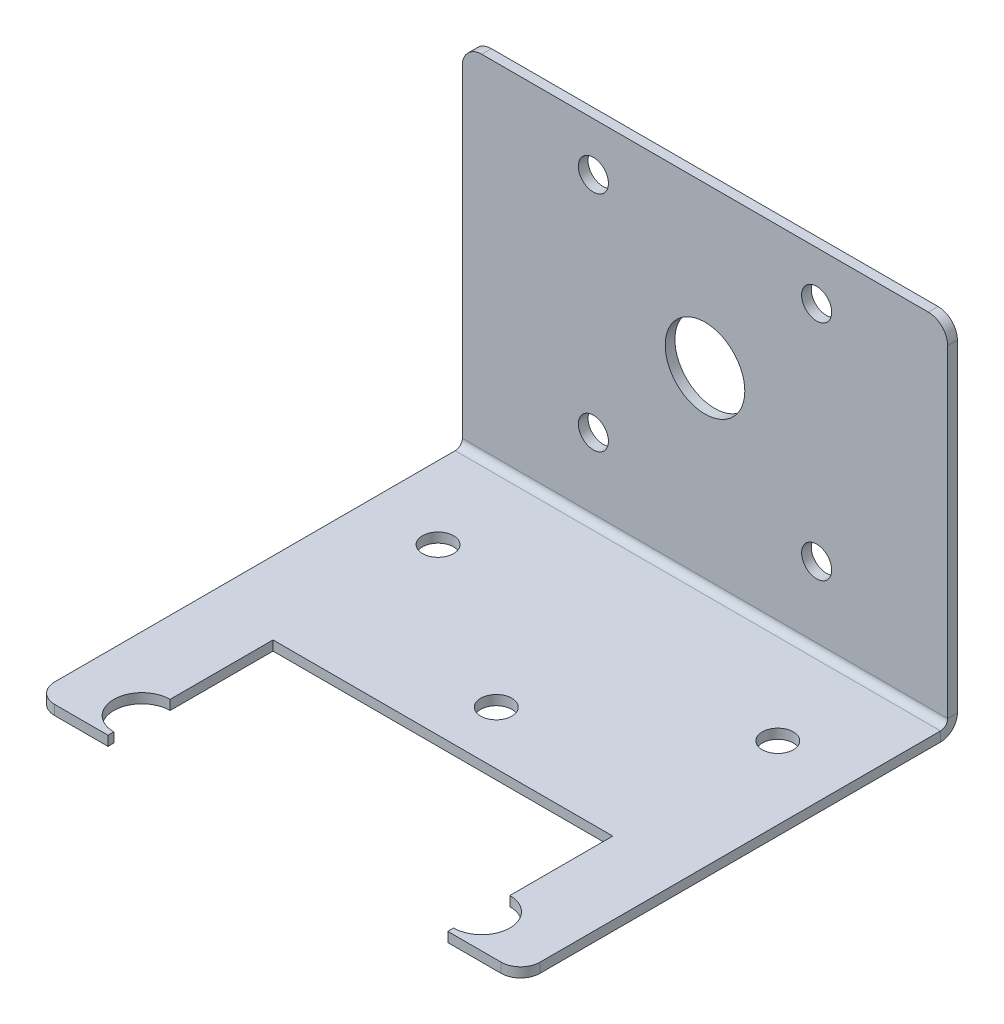
ISO-10303-21;
HEADER;
FILE_DESCRIPTION(('STEP AP214'),'2;1');
FILE_NAME('part.step','',(''),(''),'','','');
FILE_SCHEMA(('AUTOMOTIVE_DESIGN { 1 0 10303 214 1 1 1 1 }'));
ENDSEC;
DATA;
#1=APPLICATION_CONTEXT('core data for automotive mechanical design processes');
#2=APPLICATION_PROTOCOL_DEFINITION('international standard','automotive_design',2000,#1);
#3=PRODUCT_CONTEXT('',#1,'mechanical');
#4=PRODUCT('Part','Part','',(#3));
#5=PRODUCT_RELATED_PRODUCT_CATEGORY('part','',(#4));
#6=PRODUCT_DEFINITION_FORMATION('','',#4);
#7=PRODUCT_DEFINITION_CONTEXT('part definition',#1,'design');
#8=PRODUCT_DEFINITION('design','',#6,#7);
#9=PRODUCT_DEFINITION_SHAPE('','',#8);
#10=(LENGTH_UNIT() NAMED_UNIT(*) SI_UNIT(.MILLI.,.METRE.));
#11=(NAMED_UNIT(*) PLANE_ANGLE_UNIT() SI_UNIT($,.RADIAN.));
#12=(NAMED_UNIT(*) SI_UNIT($,.STERADIAN.) SOLID_ANGLE_UNIT());
#13=UNCERTAINTY_MEASURE_WITH_UNIT(LENGTH_MEASURE(1.E-05),#10,'distance_accuracy_value','');
#14=(GEOMETRIC_REPRESENTATION_CONTEXT(3) GLOBAL_UNCERTAINTY_ASSIGNED_CONTEXT((#13)) GLOBAL_UNIT_ASSIGNED_CONTEXT((#10,
#11,#12)) REPRESENTATION_CONTEXT('',''));
#15=CARTESIAN_POINT('',(0.,0.,0.));
#16=DIRECTION('',(0.,0.,1.));
#17=DIRECTION('',(1.,0.,0.));
#18=AXIS2_PLACEMENT_3D('',#15,#16,#17);
#19=CARTESIAN_POINT('',(17.5,-1.,5.5));
#20=DIRECTION('',(-1.,0.,0.));
#21=DIRECTION('',(0.,0.,1.));
#22=AXIS2_PLACEMENT_3D('',#19,#20,#21);
#23=PLANE('',#22);
#24=DIRECTION('',(0.,1.,0.));
#25=VECTOR('',#24,1.);
#26=CARTESIAN_POINT('',(17.5,-1.00100000000001,21.9));
#27=LINE('',#26,#25);
#28=CARTESIAN_POINT('',(17.5,0.,21.9));
#29=VERTEX_POINT('',#28);
#30=CARTESIAN_POINT('',(17.5,-1.,21.9));
#31=VERTEX_POINT('',#30);
#32=EDGE_CURVE('E195',#29,#31,#27,.F.);
#33=ORIENTED_EDGE('',*,*,#32,.T.);
#34=DIRECTION('',(0.,0.,1.));
#35=VECTOR('',#34,1.);
#36=CARTESIAN_POINT('',(17.5,-1.,5.5));
#37=LINE('',#36,#35);
#38=CARTESIAN_POINT('',(17.5,-1.,22.5));
#39=VERTEX_POINT('',#38);
#40=EDGE_CURVE('E427',#31,#39,#37,.T.);
#41=ORIENTED_EDGE('',*,*,#40,.T.);
#42=DIRECTION('',(0.,1.,0.));
#43=VECTOR('',#42,1.);
#44=CARTESIAN_POINT('',(17.5,-1.,22.5));
#45=LINE('',#44,#43);
#46=CARTESIAN_POINT('',(17.5,0.,22.5));
#47=VERTEX_POINT('',#46);
#48=EDGE_CURVE('E218',#39,#47,#45,.T.);
#49=ORIENTED_EDGE('',*,*,#48,.T.);
#50=DIRECTION('',(0.,0.,1.));
#51=VECTOR('',#50,1.);
#52=CARTESIAN_POINT('',(17.5,0.,5.5));
#53=LINE('',#52,#51);
#54=EDGE_CURVE('E211',#29,#47,#53,.T.);
#55=ORIENTED_EDGE('',*,*,#54,.F.);
#56=EDGE_LOOP('',(#33,#41,#49,#55));
#57=FACE_BOUND('',#56,.T.);
#58=ADVANCED_FACE('F59',(#57),#23,.T.);
#59=CARTESIAN_POINT('',(-17.5,-1.,5.5));
#60=DIRECTION('',(1.,0.,0.));
#61=DIRECTION('',(0.,0.,-1.));
#62=AXIS2_PLACEMENT_3D('',#59,#60,#61);
#63=PLANE('',#62);
#64=DIRECTION('',(0.,1.,0.));
#65=VECTOR('',#64,1.);
#66=CARTESIAN_POINT('',(-17.5,-1.00100000000001,16.1));
#67=LINE('',#66,#65);
#68=CARTESIAN_POINT('',(-17.5,0.,16.1));
#69=VERTEX_POINT('',#68);
#70=CARTESIAN_POINT('',(-17.5,-1.,16.1));
#71=VERTEX_POINT('',#70);
#72=EDGE_CURVE('E332',#69,#71,#67,.F.);
#73=ORIENTED_EDGE('',*,*,#72,.T.);
#74=DIRECTION('',(0.,0.,-1.));
#75=VECTOR('',#74,1.);
#76=CARTESIAN_POINT('',(-17.5,-1.,5.5));
#77=LINE('',#76,#75);
#78=CARTESIAN_POINT('',(-17.5,-1.,5.5));
#79=VERTEX_POINT('',#78);
#80=EDGE_CURVE('E298',#71,#79,#77,.T.);
#81=ORIENTED_EDGE('',*,*,#80,.T.);
#82=DIRECTION('',(0.,1.,0.));
#83=VECTOR('',#82,1.);
#84=CARTESIAN_POINT('',(-17.5,-1.,5.5));
#85=LINE('',#84,#83);
#86=CARTESIAN_POINT('',(-17.5,0.,5.5));
#87=VERTEX_POINT('',#86);
#88=EDGE_CURVE('E231',#79,#87,#85,.T.);
#89=ORIENTED_EDGE('',*,*,#88,.T.);
#90=DIRECTION('',(0.,0.,-1.));
#91=VECTOR('',#90,1.);
#92=CARTESIAN_POINT('',(-17.5,0.,5.5));
#93=LINE('',#92,#91);
#94=EDGE_CURVE('E282',#69,#87,#93,.T.);
#95=ORIENTED_EDGE('',*,*,#94,.F.);
#96=EDGE_LOOP('',(#73,#81,#89,#95));
#97=FACE_BOUND('',#96,.T.);
#98=ADVANCED_FACE('F296',(#97),#63,.T.);
#99=CARTESIAN_POINT('',(-25.,-1.,-22.5));
#100=DIRECTION('',(-1.,0.,0.));
#101=DIRECTION('',(0.,0.,1.));
#102=AXIS2_PLACEMENT_3D('',#99,#100,#101);
#103=PLANE('',#102);
#104=DIRECTION('',(0.,0.,1.));
#105=VECTOR('',#104,1.);
#106=CARTESIAN_POINT('',(-25.,-1.,-22.5));
#107=LINE('',#106,#105);
#108=CARTESIAN_POINT('',(-25.,-1.00000000000001,-20.7634));
#109=VERTEX_POINT('',#108);
#110=CARTESIAN_POINT('',(-25.,-1.,20.5));
#111=VERTEX_POINT('',#110);
#112=EDGE_CURVE('E274',#109,#111,#107,.T.);
#113=ORIENTED_EDGE('',*,*,#112,.T.);
#114=DIRECTION('',(0.,1.,0.));
#115=VECTOR('',#114,1.);
#116=CARTESIAN_POINT('',(-25.,-1.,20.5));
#117=LINE('',#116,#115);
#118=CARTESIAN_POINT('',(-25.,0.,20.5));
#119=VERTEX_POINT('',#118);
#120=EDGE_CURVE('E67',#111,#119,#117,.T.);
#121=ORIENTED_EDGE('',*,*,#120,.T.);
#122=DIRECTION('',(0.,0.,1.));
#123=VECTOR('',#122,1.);
#124=CARTESIAN_POINT('',(-25.,0.,-22.5));
#125=LINE('',#124,#123);
#126=CARTESIAN_POINT('',(-25.,0.,-20.7634));
#127=VERTEX_POINT('',#126);
#128=EDGE_CURVE('E273',#127,#119,#125,.T.);
#129=ORIENTED_EDGE('',*,*,#128,.F.);
#130=DIRECTION('',(0.,-1.,0.));
#131=VECTOR('',#130,1.);
#132=CARTESIAN_POINT('',(-25.,0.,-20.7634));
#133=LINE('',#132,#131);
#134=EDGE_CURVE('E403',#127,#109,#133,.T.);
#135=ORIENTED_EDGE('',*,*,#134,.T.);
#136=EDGE_LOOP('',(#113,#121,#129,#135));
#137=FACE_BOUND('',#136,.T.);
#138=ADVANCED_FACE('F271',(#137),#103,.T.);
#139=CARTESIAN_POINT('',(0.,-1.,0.));
#140=DIRECTION('',(0.,-1.,0.));
#141=DIRECTION('',(0.,0.,-1.));
#142=AXIS2_PLACEMENT_3D('',#139,#140,#141);
#143=PLANE('',#142);
#144=CARTESIAN_POINT('',(0.,-1.,0.));
#145=DIRECTION('',(0.,-1.,0.));
#146=DIRECTION('',(0.,0.,-1.));
#147=AXIS2_PLACEMENT_3D('',#144,#145,#146);
#148=CIRCLE('',#147,1.6);
#149=CARTESIAN_POINT('',(0.,-1.,-1.6));
#150=VERTEX_POINT('',#149);
#151=EDGE_CURVE('E327',#150,#150,#148,.F.);
#152=ORIENTED_EDGE('',*,*,#151,.T.);
#153=EDGE_LOOP('',(#152));
#154=FACE_BOUND('',#153,.T.);
#155=CARTESIAN_POINT('',(-17.5,-1.,-11.5));
#156=DIRECTION('',(0.,-1.,0.));
#157=DIRECTION('',(0.,0.,-1.));
#158=AXIS2_PLACEMENT_3D('',#155,#156,#157);
#159=CIRCLE('',#158,1.6);
#160=CARTESIAN_POINT('',(-17.5,-1.,-13.1));
#161=VERTEX_POINT('',#160);
#162=EDGE_CURVE('E321',#161,#161,#159,.F.);
#163=ORIENTED_EDGE('',*,*,#162,.T.);
#164=EDGE_LOOP('',(#163));
#165=FACE_BOUND('',#164,.T.);
#166=CARTESIAN_POINT('',(17.5,-1.,-11.5));
#167=DIRECTION('',(0.,-1.,0.));
#168=DIRECTION('',(0.,0.,-1.));
#169=AXIS2_PLACEMENT_3D('',#166,#167,#168);
#170=CIRCLE('',#169,1.6);
#171=CARTESIAN_POINT('',(17.5,-1.,-13.1));
#172=VERTEX_POINT('',#171);
#173=EDGE_CURVE('E311',#172,#172,#170,.F.);
#174=ORIENTED_EDGE('',*,*,#173,.T.);
#175=EDGE_LOOP('',(#174));
#176=FACE_BOUND('',#175,.T.);
#177=DIRECTION('',(0.,0.,-1.));
#178=VECTOR('',#177,1.);
#179=CARTESIAN_POINT('',(25.,-1.,-22.5));
#180=LINE('',#179,#178);
#181=CARTESIAN_POINT('',(25.,-1.,20.5));
#182=VERTEX_POINT('',#181);
#183=CARTESIAN_POINT('',(25.,-1.,-20.7634));
#184=VERTEX_POINT('',#183);
#185=EDGE_CURVE('E418',#182,#184,#180,.T.);
#186=ORIENTED_EDGE('',*,*,#185,.F.);
#187=CARTESIAN_POINT('',(23.,-1.,20.5));
#188=DIRECTION('',(0.,-1.,0.));
#189=DIRECTION('',(0.,0.,-1.));
#190=AXIS2_PLACEMENT_3D('',#187,#188,#189);
#191=CIRCLE('',#190,2.);
#192=CARTESIAN_POINT('',(23.,-1.,22.5));
#193=VERTEX_POINT('',#192);
#194=EDGE_CURVE('E265',#182,#193,#191,.T.);
#195=ORIENTED_EDGE('',*,*,#194,.T.);
#196=DIRECTION('',(1.,0.,0.));
#197=VECTOR('',#196,1.);
#198=CARTESIAN_POINT('',(17.5,-1.,22.5));
#199=LINE('',#198,#197);
#200=EDGE_CURVE('E222',#39,#193,#199,.T.);
#201=ORIENTED_EDGE('',*,*,#200,.F.);
#202=ORIENTED_EDGE('',*,*,#40,.F.);
#203=CARTESIAN_POINT('',(17.5,-1.,19.));
#204=DIRECTION('',(0.,-1.,0.));
#205=DIRECTION('',(0.,0.,-1.));
#206=AXIS2_PLACEMENT_3D('',#203,#204,#205);
#207=CIRCLE('',#206,2.9);
#208=CARTESIAN_POINT('',(17.5,-1.,16.1));
#209=VERTEX_POINT('',#208);
#210=EDGE_CURVE('E201',#31,#209,#207,.F.);
#211=ORIENTED_EDGE('',*,*,#210,.T.);
#212=CARTESIAN_POINT('',(17.5,-1.,5.5));
#213=VERTEX_POINT('',#212);
#214=EDGE_CURVE('E237',#213,#209,#37,.T.);
#215=ORIENTED_EDGE('',*,*,#214,.F.);
#216=DIRECTION('',(1.,0.,0.));
#217=VECTOR('',#216,1.);
#218=CARTESIAN_POINT('',(-17.5,-1.,5.5));
#219=LINE('',#218,#217);
#220=EDGE_CURVE('E303',#79,#213,#219,.T.);
#221=ORIENTED_EDGE('',*,*,#220,.F.);
#222=ORIENTED_EDGE('',*,*,#80,.F.);
#223=CARTESIAN_POINT('',(-17.5,-1.,19.));
#224=DIRECTION('',(0.,-1.,0.));
#225=DIRECTION('',(0.,0.,-1.));
#226=AXIS2_PLACEMENT_3D('',#223,#224,#225);
#227=CIRCLE('',#226,2.9);
#228=CARTESIAN_POINT('',(-17.5,-1.,21.9));
#229=VERTEX_POINT('',#228);
#230=EDGE_CURVE('E335',#71,#229,#227,.F.);
#231=ORIENTED_EDGE('',*,*,#230,.T.);
#232=CARTESIAN_POINT('',(-17.5,-1.,22.5));
#233=VERTEX_POINT('',#232);
#234=EDGE_CURVE('E423',#233,#229,#77,.T.);
#235=ORIENTED_EDGE('',*,*,#234,.F.);
#236=DIRECTION('',(1.,0.,0.));
#237=VECTOR('',#236,1.);
#238=CARTESIAN_POINT('',(-25.,-1.,22.5));
#239=LINE('',#238,#237);
#240=CARTESIAN_POINT('',(-23.,-1.,22.5));
#241=VERTEX_POINT('',#240);
#242=EDGE_CURVE('E421',#241,#233,#239,.T.);
#243=ORIENTED_EDGE('',*,*,#242,.F.);
#244=CARTESIAN_POINT('',(-23.,-1.,20.5));
#245=DIRECTION('',(0.,-1.,0.));
#246=DIRECTION('',(0.,0.,-1.));
#247=AXIS2_PLACEMENT_3D('',#244,#245,#246);
#248=CIRCLE('',#247,2.);
#249=EDGE_CURVE('E74',#241,#111,#248,.T.);
#250=ORIENTED_EDGE('',*,*,#249,.T.);
#251=ORIENTED_EDGE('',*,*,#112,.F.);
#252=DIRECTION('',(-1.,0.,0.));
#253=VECTOR('',#252,1.);
#254=CARTESIAN_POINT('',(-25.,-1.00000000000001,-20.7634));
#255=LINE('',#254,#253);
#256=EDGE_CURVE('E396',#109,#184,#255,.F.);
#257=ORIENTED_EDGE('',*,*,#256,.T.);
#258=EDGE_LOOP('',(#186,#195,#201,#202,#211,#215,#221,#222,#231,#235,#243,#250,#251,#257));
#259=FACE_BOUND('',#258,.T.);
#260=ADVANCED_FACE('F442',(#154,#165,#176,#259),#143,.T.);
#261=CARTESIAN_POINT('',(0.,0.,0.));
#262=DIRECTION('',(0.,-1.,0.));
#263=DIRECTION('',(0.,0.,-1.));
#264=AXIS2_PLACEMENT_3D('',#261,#262,#263);
#265=PLANE('',#264);
#266=CARTESIAN_POINT('',(0.,0.,0.));
#267=DIRECTION('',(0.,1.,0.));
#268=DIRECTION('',(0.,0.,1.));
#269=AXIS2_PLACEMENT_3D('',#266,#267,#268);
#270=CIRCLE('',#269,1.6);
#271=CARTESIAN_POINT('',(0.,0.,1.6));
#272=VERTEX_POINT('',#271);
#273=EDGE_CURVE('E324',#272,#272,#270,.T.);
#274=ORIENTED_EDGE('',*,*,#273,.F.);
#275=EDGE_LOOP('',(#274));
#276=FACE_BOUND('',#275,.T.);
#277=CARTESIAN_POINT('',(-17.5,0.,-11.5));
#278=DIRECTION('',(0.,1.,0.));
#279=DIRECTION('',(0.,0.,1.));
#280=AXIS2_PLACEMENT_3D('',#277,#278,#279);
#281=CIRCLE('',#280,1.6);
#282=CARTESIAN_POINT('',(-17.5,0.,-9.9));
#283=VERTEX_POINT('',#282);
#284=EDGE_CURVE('E318',#283,#283,#281,.T.);
#285=ORIENTED_EDGE('',*,*,#284,.F.);
#286=EDGE_LOOP('',(#285));
#287=FACE_BOUND('',#286,.T.);
#288=CARTESIAN_POINT('',(17.5,0.,-11.5));
#289=DIRECTION('',(0.,1.,0.));
#290=DIRECTION('',(0.,0.,-1.));
#291=AXIS2_PLACEMENT_3D('',#288,#289,#290);
#292=CIRCLE('',#291,1.6);
#293=CARTESIAN_POINT('',(17.5,0.,-13.1));
#294=VERTEX_POINT('',#293);
#295=EDGE_CURVE('E308',#294,#294,#292,.T.);
#296=ORIENTED_EDGE('',*,*,#295,.F.);
#297=EDGE_LOOP('',(#296));
#298=FACE_BOUND('',#297,.T.);
#299=DIRECTION('',(1.,0.,0.));
#300=VECTOR('',#299,1.);
#301=CARTESIAN_POINT('',(17.5,0.,22.5));
#302=LINE('',#301,#300);
#303=CARTESIAN_POINT('',(23.,0.,22.5));
#304=VERTEX_POINT('',#303);
#305=EDGE_CURVE('E284',#47,#304,#302,.T.);
#306=ORIENTED_EDGE('',*,*,#305,.T.);
#307=CARTESIAN_POINT('',(23.,0.,20.5));
#308=DIRECTION('',(0.,-1.,0.));
#309=DIRECTION('',(0.,0.,-1.));
#310=AXIS2_PLACEMENT_3D('',#307,#308,#309);
#311=CIRCLE('',#310,2.);
#312=CARTESIAN_POINT('',(25.,0.,20.5));
#313=VERTEX_POINT('',#312);
#314=EDGE_CURVE('E260',#304,#313,#311,.F.);
#315=ORIENTED_EDGE('',*,*,#314,.T.);
#316=DIRECTION('',(0.,0.,-1.));
#317=VECTOR('',#316,1.);
#318=CARTESIAN_POINT('',(25.,0.,-22.5));
#319=LINE('',#318,#317);
#320=CARTESIAN_POINT('',(25.,0.,-20.7634));
#321=VERTEX_POINT('',#320);
#322=EDGE_CURVE('E280',#313,#321,#319,.T.);
#323=ORIENTED_EDGE('',*,*,#322,.T.);
#324=DIRECTION('',(-1.,0.,0.));
#325=VECTOR('',#324,1.);
#326=CARTESIAN_POINT('',(-25.,0.,-20.7634));
#327=LINE('',#326,#325);
#328=EDGE_CURVE('E278',#127,#321,#327,.F.);
#329=ORIENTED_EDGE('',*,*,#328,.F.);
#330=ORIENTED_EDGE('',*,*,#128,.T.);
#331=CARTESIAN_POINT('',(-23.,0.,20.5));
#332=DIRECTION('',(0.,-1.,0.));
#333=DIRECTION('',(0.,0.,-1.));
#334=AXIS2_PLACEMENT_3D('',#331,#332,#333);
#335=CIRCLE('',#334,2.);
#336=CARTESIAN_POINT('',(-23.,0.,22.5));
#337=VERTEX_POINT('',#336);
#338=EDGE_CURVE('E258',#119,#337,#335,.F.);
#339=ORIENTED_EDGE('',*,*,#338,.T.);
#340=DIRECTION('',(1.,0.,0.));
#341=VECTOR('',#340,1.);
#342=CARTESIAN_POINT('',(-25.,0.,22.5));
#343=LINE('',#342,#341);
#344=CARTESIAN_POINT('',(-17.5,0.,22.5));
#345=VERTEX_POINT('',#344);
#346=EDGE_CURVE('E279',#337,#345,#343,.T.);
#347=ORIENTED_EDGE('',*,*,#346,.T.);
#348=CARTESIAN_POINT('',(-17.5,0.,21.9));
#349=VERTEX_POINT('',#348);
#350=EDGE_CURVE('E223',#345,#349,#93,.T.);
#351=ORIENTED_EDGE('',*,*,#350,.T.);
#352=CARTESIAN_POINT('',(-17.5,0.,19.));
#353=DIRECTION('',(0.,1.,0.));
#354=DIRECTION('',(0.,0.,1.));
#355=AXIS2_PLACEMENT_3D('',#352,#353,#354);
#356=CIRCLE('',#355,2.9);
#357=EDGE_CURVE('E292',#69,#349,#356,.T.);
#358=ORIENTED_EDGE('',*,*,#357,.F.);
#359=ORIENTED_EDGE('',*,*,#94,.T.);
#360=DIRECTION('',(1.,0.,0.));
#361=VECTOR('',#360,1.);
#362=CARTESIAN_POINT('',(-17.5,0.,5.5));
#363=LINE('',#362,#361);
#364=CARTESIAN_POINT('',(17.5,0.,5.5));
#365=VERTEX_POINT('',#364);
#366=EDGE_CURVE('E220',#87,#365,#363,.T.);
#367=ORIENTED_EDGE('',*,*,#366,.T.);
#368=CARTESIAN_POINT('',(17.5,0.,16.1));
#369=VERTEX_POINT('',#368);
#370=EDGE_CURVE('E215',#365,#369,#53,.T.);
#371=ORIENTED_EDGE('',*,*,#370,.T.);
#372=CARTESIAN_POINT('',(17.5,0.,19.));
#373=DIRECTION('',(0.,1.,0.));
#374=DIRECTION('',(0.,0.,-1.));
#375=AXIS2_PLACEMENT_3D('',#372,#373,#374);
#376=CIRCLE('',#375,2.9);
#377=EDGE_CURVE('E198',#29,#369,#376,.T.);
#378=ORIENTED_EDGE('',*,*,#377,.F.);
#379=ORIENTED_EDGE('',*,*,#54,.T.);
#380=EDGE_LOOP('',(#306,#315,#323,#329,#330,#339,#347,#351,#358,#359,#367,#371,#378,#379));
#381=FACE_BOUND('',#380,.T.);
#382=ADVANCED_FACE('F210',(#276,#287,#298,#381),#265,.F.);
#383=CARTESIAN_POINT('',(17.5,-1.,22.5));
#384=DIRECTION('',(0.,0.,1.));
#385=DIRECTION('',(1.,0.,0.));
#386=AXIS2_PLACEMENT_3D('',#383,#384,#385);
#387=PLANE('',#386);
#388=ORIENTED_EDGE('',*,*,#200,.T.);
#389=DIRECTION('',(0.,1.,0.));
#390=VECTOR('',#389,1.);
#391=CARTESIAN_POINT('',(23.,-1.,22.5));
#392=LINE('',#391,#390);
#393=EDGE_CURVE('E255',#193,#304,#392,.T.);
#394=ORIENTED_EDGE('',*,*,#393,.T.);
#395=ORIENTED_EDGE('',*,*,#305,.F.);
#396=ORIENTED_EDGE('',*,*,#48,.F.);
#397=EDGE_LOOP('',(#388,#394,#395,#396));
#398=FACE_BOUND('',#397,.T.);
#399=ADVANCED_FACE('F430',(#398),#387,.T.);
#400=DIRECTION('',(0.,1.,0.));
#401=VECTOR('',#400,1.);
#402=CARTESIAN_POINT('',(17.5,-1.00100000000001,16.1));
#403=LINE('',#402,#401);
#404=EDGE_CURVE('E205',#209,#369,#403,.T.);
#405=ORIENTED_EDGE('',*,*,#404,.T.);
#406=ORIENTED_EDGE('',*,*,#370,.F.);
#407=DIRECTION('',(0.,1.,0.));
#408=VECTOR('',#407,1.);
#409=CARTESIAN_POINT('',(17.5,-1.,5.5));
#410=LINE('',#409,#408);
#411=EDGE_CURVE('E229',#213,#365,#410,.T.);
#412=ORIENTED_EDGE('',*,*,#411,.F.);
#413=ORIENTED_EDGE('',*,*,#214,.T.);
#414=EDGE_LOOP('',(#405,#406,#412,#413));
#415=FACE_BOUND('',#414,.T.);
#416=ADVANCED_FACE('F307',(#415),#23,.T.);
#417=CARTESIAN_POINT('',(-17.5,-1.,5.5));
#418=DIRECTION('',(0.,0.,1.));
#419=DIRECTION('',(1.,0.,0.));
#420=AXIS2_PLACEMENT_3D('',#417,#418,#419);
#421=PLANE('',#420);
#422=ORIENTED_EDGE('',*,*,#366,.F.);
#423=ORIENTED_EDGE('',*,*,#88,.F.);
#424=ORIENTED_EDGE('',*,*,#220,.T.);
#425=ORIENTED_EDGE('',*,*,#411,.T.);
#426=EDGE_LOOP('',(#422,#423,#424,#425));
#427=FACE_BOUND('',#426,.T.);
#428=ADVANCED_FACE('F302',(#427),#421,.T.);
#429=DIRECTION('',(0.,1.,0.));
#430=VECTOR('',#429,1.);
#431=CARTESIAN_POINT('',(-17.5,-1.00100000000001,21.9));
#432=LINE('',#431,#430);
#433=EDGE_CURVE('E314',#229,#349,#432,.T.);
#434=ORIENTED_EDGE('',*,*,#433,.T.);
#435=ORIENTED_EDGE('',*,*,#350,.F.);
#436=DIRECTION('',(0.,1.,0.));
#437=VECTOR('',#436,1.);
#438=CARTESIAN_POINT('',(-17.5,-1.,22.5));
#439=LINE('',#438,#437);
#440=EDGE_CURVE('E234',#233,#345,#439,.T.);
#441=ORIENTED_EDGE('',*,*,#440,.F.);
#442=ORIENTED_EDGE('',*,*,#234,.T.);
#443=EDGE_LOOP('',(#434,#435,#441,#442));
#444=FACE_BOUND('',#443,.T.);
#445=ADVANCED_FACE('F502',(#444),#63,.T.);
#446=CARTESIAN_POINT('',(-25.,-1.,22.5));
#447=DIRECTION('',(0.,0.,1.));
#448=DIRECTION('',(1.,0.,0.));
#449=AXIS2_PLACEMENT_3D('',#446,#447,#448);
#450=PLANE('',#449);
#451=ORIENTED_EDGE('',*,*,#346,.F.);
#452=DIRECTION('',(0.,1.,0.));
#453=VECTOR('',#452,1.);
#454=CARTESIAN_POINT('',(-23.,-1.,22.5));
#455=LINE('',#454,#453);
#456=EDGE_CURVE('E13',#337,#241,#455,.F.);
#457=ORIENTED_EDGE('',*,*,#456,.T.);
#458=ORIENTED_EDGE('',*,*,#242,.T.);
#459=ORIENTED_EDGE('',*,*,#440,.T.);
#460=EDGE_LOOP('',(#451,#457,#458,#459));
#461=FACE_BOUND('',#460,.T.);
#462=ADVANCED_FACE('F596',(#461),#450,.T.);
#463=CARTESIAN_POINT('',(25.,-1.,-22.5));
#464=DIRECTION('',(1.,0.,0.));
#465=DIRECTION('',(0.,0.,-1.));
#466=AXIS2_PLACEMENT_3D('',#463,#464,#465);
#467=PLANE('',#466);
#468=ORIENTED_EDGE('',*,*,#322,.F.);
#469=DIRECTION('',(0.,1.,0.));
#470=VECTOR('',#469,1.);
#471=CARTESIAN_POINT('',(25.,-1.,20.5));
#472=LINE('',#471,#470);
#473=EDGE_CURVE('E262',#313,#182,#472,.F.);
#474=ORIENTED_EDGE('',*,*,#473,.T.);
#475=ORIENTED_EDGE('',*,*,#185,.T.);
#476=DIRECTION('',(0.,-1.,0.));
#477=VECTOR('',#476,1.);
#478=CARTESIAN_POINT('',(25.,0.,-20.7634));
#479=LINE('',#478,#477);
#480=EDGE_CURVE('E412',#321,#184,#479,.T.);
#481=ORIENTED_EDGE('',*,*,#480,.F.);
#482=EDGE_LOOP('',(#468,#474,#475,#481));
#483=FACE_BOUND('',#482,.T.);
#484=ADVANCED_FACE('F439',(#483),#467,.T.);
#485=CARTESIAN_POINT('',(25.,0.736599999999992,-20.7634));
#486=DIRECTION('',(1.,0.,0.));
#487=DIRECTION('',(0.,0.,-1.));
#488=AXIS2_PLACEMENT_3D('',#485,#486,#487);
#489=PLANE('',#488);
#490=DIRECTION('',(0.,0.,1.));
#491=VECTOR('',#490,1.);
#492=CARTESIAN_POINT('',(25.,0.736600000000004,-22.5));
#493=LINE('',#492,#491);
#494=CARTESIAN_POINT('',(25.,0.736599999999989,-21.5));
#495=VERTEX_POINT('',#494);
#496=CARTESIAN_POINT('',(25.,0.736599999999986,-22.5));
#497=VERTEX_POINT('',#496);
#498=EDGE_CURVE('E368',#495,#497,#493,.F.);
#499=ORIENTED_EDGE('',*,*,#498,.F.);
#500=CARTESIAN_POINT('',(25.,0.736599999999992,-20.7634));
#501=DIRECTION('',(-1.,0.,0.));
#502=DIRECTION('',(0.,0.,1.));
#503=AXIS2_PLACEMENT_3D('',#500,#501,#502);
#504=CIRCLE('',#503,0.7366);
#505=EDGE_CURVE('E406',#321,#495,#504,.F.);
#506=ORIENTED_EDGE('',*,*,#505,.F.);
#507=ORIENTED_EDGE('',*,*,#480,.T.);
#508=CARTESIAN_POINT('',(25.,0.736599999999992,-20.7634));
#509=DIRECTION('',(-1.,0.,0.));
#510=DIRECTION('',(0.,0.,1.));
#511=AXIS2_PLACEMENT_3D('',#508,#509,#510);
#512=CIRCLE('',#511,1.7366);
#513=EDGE_CURVE('E399',#184,#497,#512,.F.);
#514=ORIENTED_EDGE('',*,*,#513,.T.);
#515=EDGE_LOOP('',(#499,#506,#507,#514));
#516=FACE_BOUND('',#515,.T.);
#517=ADVANCED_FACE('F477',(#516),#489,.T.);
#518=CARTESIAN_POINT('',(-25.,0.736599999999992,-20.7634));
#519=DIRECTION('',(1.,0.,0.));
#520=DIRECTION('',(0.,0.,-1.));
#521=AXIS2_PLACEMENT_3D('',#518,#519,#520);
#522=PLANE('',#521);
#523=CARTESIAN_POINT('',(-25.,0.736599999999992,-20.7634));
#524=DIRECTION('',(-1.,0.,0.));
#525=DIRECTION('',(0.,0.,1.));
#526=AXIS2_PLACEMENT_3D('',#523,#524,#525);
#527=CIRCLE('',#526,0.7366);
#528=CARTESIAN_POINT('',(-25.,0.736599999999989,-21.5));
#529=VERTEX_POINT('',#528);
#530=EDGE_CURVE('E372',#529,#127,#527,.T.);
#531=ORIENTED_EDGE('',*,*,#530,.F.);
#532=DIRECTION('',(0.,0.,1.));
#533=VECTOR('',#532,1.);
#534=CARTESIAN_POINT('',(-25.,0.736599999999997,-21.5));
#535=LINE('',#534,#533);
#536=CARTESIAN_POINT('',(-25.,0.736600000000004,-22.5));
#537=VERTEX_POINT('',#536);
#538=EDGE_CURVE('E389',#529,#537,#535,.F.);
#539=ORIENTED_EDGE('',*,*,#538,.T.);
#540=CARTESIAN_POINT('',(-25.,0.736599999999992,-20.7634));
#541=DIRECTION('',(-1.,0.,0.));
#542=DIRECTION('',(0.,0.,1.));
#543=AXIS2_PLACEMENT_3D('',#540,#541,#542);
#544=CIRCLE('',#543,1.7366);
#545=EDGE_CURVE('E400',#537,#109,#544,.T.);
#546=ORIENTED_EDGE('',*,*,#545,.T.);
#547=ORIENTED_EDGE('',*,*,#134,.F.);
#548=EDGE_LOOP('',(#531,#539,#546,#547));
#549=FACE_BOUND('',#548,.T.);
#550=ADVANCED_FACE('F447',(#549),#522,.F.);
#551=CARTESIAN_POINT('',(-25.,0.736599999999992,-20.7634));
#552=DIRECTION('',(-1.,0.,0.));
#553=DIRECTION('',(0.,0.,-1.));
#554=AXIS2_PLACEMENT_3D('',#551,#552,#553);
#555=CYLINDRICAL_SURFACE('',#554,1.7366);
#556=ORIENTED_EDGE('',*,*,#256,.F.);
#557=ORIENTED_EDGE('',*,*,#545,.F.);
#558=DIRECTION('',(-1.,0.,0.));
#559=VECTOR('',#558,1.);
#560=CARTESIAN_POINT('',(25.,0.736600000000004,-22.5));
#561=LINE('',#560,#559);
#562=EDGE_CURVE('E386',#537,#497,#561,.F.);
#563=ORIENTED_EDGE('',*,*,#562,.T.);
#564=ORIENTED_EDGE('',*,*,#513,.F.);
#565=EDGE_LOOP('',(#556,#557,#563,#564));
#566=FACE_BOUND('',#565,.T.);
#567=ADVANCED_FACE('F444',(#566),#555,.T.);
#568=CARTESIAN_POINT('',(-25.,0.736599999999992,-20.7634));
#569=DIRECTION('',(-1.,0.,0.));
#570=DIRECTION('',(0.,0.,-1.));
#571=AXIS2_PLACEMENT_3D('',#568,#569,#570);
#572=CYLINDRICAL_SURFACE('',#571,0.7366);
#573=ORIENTED_EDGE('',*,*,#328,.T.);
#574=ORIENTED_EDGE('',*,*,#505,.T.);
#575=DIRECTION('',(-1.,0.,0.));
#576=VECTOR('',#575,1.);
#577=CARTESIAN_POINT('',(25.,0.736599999999997,-21.5));
#578=LINE('',#577,#576);
#579=EDGE_CURVE('E392',#495,#529,#578,.T.);
#580=ORIENTED_EDGE('',*,*,#579,.T.);
#581=ORIENTED_EDGE('',*,*,#530,.T.);
#582=EDGE_LOOP('',(#573,#574,#580,#581));
#583=FACE_BOUND('',#582,.T.);
#584=ADVANCED_FACE('F480',(#583),#572,.F.);
#585=CARTESIAN_POINT('',(25.,0.,-22.5));
#586=DIRECTION('',(-1.,0.,0.));
#587=DIRECTION('',(0.,0.,1.));
#588=AXIS2_PLACEMENT_3D('',#585,#586,#587);
#589=PLANE('',#588);
#590=DIRECTION('',(0.,-1.,0.));
#591=VECTOR('',#590,1.);
#592=CARTESIAN_POINT('',(25.,0.,-22.5));
#593=LINE('',#592,#591);
#594=CARTESIAN_POINT('',(25.,34.,-22.5000000000001));
#595=VERTEX_POINT('',#594);
#596=EDGE_CURVE('E376',#595,#497,#593,.T.);
#597=ORIENTED_EDGE('',*,*,#596,.F.);
#598=DIRECTION('',(0.,0.,1.));
#599=VECTOR('',#598,1.);
#600=CARTESIAN_POINT('',(25.,34.,-22.5000000000001));
#601=LINE('',#600,#599);
#602=CARTESIAN_POINT('',(25.,34.,-21.5000000000001));
#603=VERTEX_POINT('',#602);
#604=EDGE_CURVE('E228',#595,#603,#601,.T.);
#605=ORIENTED_EDGE('',*,*,#604,.T.);
#606=DIRECTION('',(0.,1.,0.));
#607=VECTOR('',#606,1.);
#608=CARTESIAN_POINT('',(25.,0.,-21.5));
#609=LINE('',#608,#607);
#610=EDGE_CURVE('E384',#603,#495,#609,.F.);
#611=ORIENTED_EDGE('',*,*,#610,.T.);
#612=ORIENTED_EDGE('',*,*,#498,.T.);
#613=EDGE_LOOP('',(#597,#605,#611,#612));
#614=FACE_BOUND('',#613,.T.);
#615=ADVANCED_FACE('F472',(#614),#589,.F.);
#616=CARTESIAN_POINT('',(-25.,36.,-22.5000000000001));
#617=DIRECTION('',(1.,0.,0.));
#618=DIRECTION('',(0.,0.,-1.));
#619=AXIS2_PLACEMENT_3D('',#616,#617,#618);
#620=PLANE('',#619);
#621=DIRECTION('',(0.,-1.,0.));
#622=VECTOR('',#621,1.);
#623=CARTESIAN_POINT('',(-25.,36.,-21.5000000000001));
#624=LINE('',#623,#622);
#625=CARTESIAN_POINT('',(-25.,34.,-21.5000000000001));
#626=VERTEX_POINT('',#625);
#627=EDGE_CURVE('E381',#529,#626,#624,.F.);
#628=ORIENTED_EDGE('',*,*,#627,.T.);
#629=DIRECTION('',(0.,0.,1.));
#630=VECTOR('',#629,1.);
#631=CARTESIAN_POINT('',(-25.,34.,-22.5000000000001));
#632=LINE('',#631,#630);
#633=CARTESIAN_POINT('',(-25.,34.,-22.5000000000001));
#634=VERTEX_POINT('',#633);
#635=EDGE_CURVE('E253',#626,#634,#632,.F.);
#636=ORIENTED_EDGE('',*,*,#635,.T.);
#637=DIRECTION('',(0.,1.,0.));
#638=VECTOR('',#637,1.);
#639=CARTESIAN_POINT('',(-25.,0.,-22.5));
#640=LINE('',#639,#638);
#641=EDGE_CURVE('E373',#537,#634,#640,.T.);
#642=ORIENTED_EDGE('',*,*,#641,.F.);
#643=ORIENTED_EDGE('',*,*,#538,.F.);
#644=EDGE_LOOP('',(#628,#636,#642,#643));
#645=FACE_BOUND('',#644,.T.);
#646=ADVANCED_FACE('F457',(#645),#620,.F.);
#647=CARTESIAN_POINT('',(0.,0.,-22.5));
#648=DIRECTION('',(0.,0.,1.));
#649=DIRECTION('',(0.,-1.,0.));
#650=AXIS2_PLACEMENT_3D('',#647,#648,#649);
#651=PLANE('',#650);
#652=CARTESIAN_POINT('',(0.,19.5,-22.5000000000001));
#653=DIRECTION('',(0.,0.,1.));
#654=DIRECTION('',(0.,-1.,0.));
#655=AXIS2_PLACEMENT_3D('',#652,#653,#654);
#656=CIRCLE('',#655,4.1);
#657=CARTESIAN_POINT('',(0.,15.4,-22.5000000000001));
#658=VERTEX_POINT('',#657);
#659=EDGE_CURVE('E365',#658,#658,#656,.T.);
#660=ORIENTED_EDGE('',*,*,#659,.T.);
#661=EDGE_LOOP('',(#660));
#662=FACE_BOUND('',#661,.T.);
#663=CARTESIAN_POINT('',(-11.5,7.99999999999999,-22.5));
#664=DIRECTION('',(0.,0.,1.));
#665=DIRECTION('',(0.,-1.,0.));
#666=AXIS2_PLACEMENT_3D('',#663,#664,#665);
#667=CIRCLE('',#666,1.55);
#668=CARTESIAN_POINT('',(-11.5,6.44999999999999,-22.5));
#669=VERTEX_POINT('',#668);
#670=EDGE_CURVE('E362',#669,#669,#667,.T.);
#671=ORIENTED_EDGE('',*,*,#670,.T.);
#672=EDGE_LOOP('',(#671));
#673=FACE_BOUND('',#672,.T.);
#674=CARTESIAN_POINT('',(11.5,7.99999999999999,-22.5));
#675=DIRECTION('',(0.,0.,1.));
#676=DIRECTION('',(0.,-1.,0.));
#677=AXIS2_PLACEMENT_3D('',#674,#675,#676);
#678=CIRCLE('',#677,1.55);
#679=CARTESIAN_POINT('',(11.5,6.44999999999999,-22.5));
#680=VERTEX_POINT('',#679);
#681=EDGE_CURVE('E359',#680,#680,#678,.T.);
#682=ORIENTED_EDGE('',*,*,#681,.T.);
#683=EDGE_LOOP('',(#682));
#684=FACE_BOUND('',#683,.T.);
#685=CARTESIAN_POINT('',(11.5,31.,-22.5000000000001));
#686=DIRECTION('',(0.,0.,1.));
#687=DIRECTION('',(0.,-1.,0.));
#688=AXIS2_PLACEMENT_3D('',#685,#686,#687);
#689=CIRCLE('',#688,1.55);
#690=CARTESIAN_POINT('',(11.5,29.45,-22.5000000000001));
#691=VERTEX_POINT('',#690);
#692=EDGE_CURVE('E356',#691,#691,#689,.T.);
#693=ORIENTED_EDGE('',*,*,#692,.T.);
#694=EDGE_LOOP('',(#693));
#695=FACE_BOUND('',#694,.T.);
#696=CARTESIAN_POINT('',(-11.5,31.,-22.5000000000001));
#697=DIRECTION('',(0.,0.,1.));
#698=DIRECTION('',(0.,-1.,0.));
#699=AXIS2_PLACEMENT_3D('',#696,#697,#698);
#700=CIRCLE('',#699,1.55);
#701=CARTESIAN_POINT('',(-11.5,29.45,-22.5000000000001));
#702=VERTEX_POINT('',#701);
#703=EDGE_CURVE('E353',#702,#702,#700,.T.);
#704=ORIENTED_EDGE('',*,*,#703,.T.);
#705=EDGE_LOOP('',(#704));
#706=FACE_BOUND('',#705,.T.);
#707=DIRECTION('',(1.,0.,0.));
#708=VECTOR('',#707,1.);
#709=CARTESIAN_POINT('',(0.,36.,-22.5000000000001));
#710=LINE('',#709,#708);
#711=CARTESIAN_POINT('',(-23.,36.,-22.5000000000001));
#712=VERTEX_POINT('',#711);
#713=CARTESIAN_POINT('',(23.,36.,-22.5000000000001));
#714=VERTEX_POINT('',#713);
#715=EDGE_CURVE('E369',#712,#714,#710,.T.);
#716=ORIENTED_EDGE('',*,*,#715,.T.);
#717=CARTESIAN_POINT('',(23.,34.,-22.5000000000001));
#718=DIRECTION('',(0.,0.,1.));
#719=DIRECTION('',(0.,-1.,0.));
#720=AXIS2_PLACEMENT_3D('',#717,#718,#719);
#721=CIRCLE('',#720,2.);
#722=EDGE_CURVE('E251',#714,#595,#721,.F.);
#723=ORIENTED_EDGE('',*,*,#722,.T.);
#724=ORIENTED_EDGE('',*,*,#596,.T.);
#725=ORIENTED_EDGE('',*,*,#562,.F.);
#726=ORIENTED_EDGE('',*,*,#641,.T.);
#727=CARTESIAN_POINT('',(-23.,34.,-22.5000000000001));
#728=DIRECTION('',(0.,0.,1.));
#729=DIRECTION('',(0.,-1.,0.));
#730=AXIS2_PLACEMENT_3D('',#727,#728,#729);
#731=CIRCLE('',#730,2.);
#732=EDGE_CURVE('E249',#634,#712,#731,.F.);
#733=ORIENTED_EDGE('',*,*,#732,.T.);
#734=EDGE_LOOP('',(#716,#723,#724,#725,#726,#733));
#735=FACE_BOUND('',#734,.T.);
#736=ADVANCED_FACE('F454',(#662,#673,#684,#695,#706,#735),#651,.F.);
#737=CARTESIAN_POINT('',(0.,0.,-21.5));
#738=DIRECTION('',(0.,0.,1.));
#739=DIRECTION('',(0.,-1.,0.));
#740=AXIS2_PLACEMENT_3D('',#737,#738,#739);
#741=PLANE('',#740);
#742=CARTESIAN_POINT('',(0.,19.5,-21.5));
#743=DIRECTION('',(0.,0.,1.));
#744=DIRECTION('',(1.,0.,0.));
#745=AXIS2_PLACEMENT_3D('',#742,#743,#744);
#746=CIRCLE('',#745,4.1);
#747=CARTESIAN_POINT('',(4.1,19.5,-21.5));
#748=VERTEX_POINT('',#747);
#749=EDGE_CURVE('E338',#748,#748,#746,.T.);
#750=ORIENTED_EDGE('',*,*,#749,.F.);
#751=EDGE_LOOP('',(#750));
#752=FACE_BOUND('',#751,.T.);
#753=CARTESIAN_POINT('',(-11.5,7.99999999999999,-21.5));
#754=DIRECTION('',(0.,0.,1.));
#755=DIRECTION('',(1.,0.,0.));
#756=AXIS2_PLACEMENT_3D('',#753,#754,#755);
#757=CIRCLE('',#756,1.55);
#758=CARTESIAN_POINT('',(-9.95,7.99999999999999,-21.5));
#759=VERTEX_POINT('',#758);
#760=EDGE_CURVE('E346',#759,#759,#757,.T.);
#761=ORIENTED_EDGE('',*,*,#760,.F.);
#762=EDGE_LOOP('',(#761));
#763=FACE_BOUND('',#762,.T.);
#764=CARTESIAN_POINT('',(11.5,7.99999999999999,-21.5));
#765=DIRECTION('',(0.,0.,1.));
#766=DIRECTION('',(1.,0.,0.));
#767=AXIS2_PLACEMENT_3D('',#764,#765,#766);
#768=CIRCLE('',#767,1.55);
#769=CARTESIAN_POINT('',(13.05,7.99999999999999,-21.5));
#770=VERTEX_POINT('',#769);
#771=EDGE_CURVE('E343',#770,#770,#768,.T.);
#772=ORIENTED_EDGE('',*,*,#771,.F.);
#773=EDGE_LOOP('',(#772));
#774=FACE_BOUND('',#773,.T.);
#775=CARTESIAN_POINT('',(11.5,31.,-21.5));
#776=DIRECTION('',(0.,0.,1.));
#777=DIRECTION('',(1.,0.,0.));
#778=AXIS2_PLACEMENT_3D('',#775,#776,#777);
#779=CIRCLE('',#778,1.55);
#780=CARTESIAN_POINT('',(13.05,31.,-21.5));
#781=VERTEX_POINT('',#780);
#782=EDGE_CURVE('E339',#781,#781,#779,.T.);
#783=ORIENTED_EDGE('',*,*,#782,.F.);
#784=EDGE_LOOP('',(#783));
#785=FACE_BOUND('',#784,.T.);
#786=CARTESIAN_POINT('',(-11.5,31.,-21.5));
#787=DIRECTION('',(0.,0.,1.));
#788=DIRECTION('',(1.,0.,0.));
#789=AXIS2_PLACEMENT_3D('',#786,#787,#788);
#790=CIRCLE('',#789,1.55);
#791=CARTESIAN_POINT('',(-9.95,31.,-21.5));
#792=VERTEX_POINT('',#791);
#793=EDGE_CURVE('E342',#792,#792,#790,.T.);
#794=ORIENTED_EDGE('',*,*,#793,.F.);
#795=EDGE_LOOP('',(#794));
#796=FACE_BOUND('',#795,.T.);
#797=ORIENTED_EDGE('',*,*,#610,.F.);
#798=CARTESIAN_POINT('',(23.,34.,-21.5000000000001));
#799=DIRECTION('',(0.,0.,1.));
#800=DIRECTION('',(0.,-1.,0.));
#801=AXIS2_PLACEMENT_3D('',#798,#799,#800);
#802=CIRCLE('',#801,2.);
#803=CARTESIAN_POINT('',(23.,36.,-21.5000000000001));
#804=VERTEX_POINT('',#803);
#805=EDGE_CURVE('E242',#603,#804,#802,.T.);
#806=ORIENTED_EDGE('',*,*,#805,.T.);
#807=DIRECTION('',(-1.,0.,0.));
#808=VECTOR('',#807,1.);
#809=CARTESIAN_POINT('',(25.,36.,-21.5000000000001));
#810=LINE('',#809,#808);
#811=CARTESIAN_POINT('',(-23.,36.,-21.5000000000001));
#812=VERTEX_POINT('',#811);
#813=EDGE_CURVE('E378',#812,#804,#810,.F.);
#814=ORIENTED_EDGE('',*,*,#813,.F.);
#815=CARTESIAN_POINT('',(-23.,34.,-21.5000000000001));
#816=DIRECTION('',(0.,0.,1.));
#817=DIRECTION('',(0.,-1.,0.));
#818=AXIS2_PLACEMENT_3D('',#815,#816,#817);
#819=CIRCLE('',#818,2.);
#820=EDGE_CURVE('E240',#812,#626,#819,.T.);
#821=ORIENTED_EDGE('',*,*,#820,.T.);
#822=ORIENTED_EDGE('',*,*,#627,.F.);
#823=ORIENTED_EDGE('',*,*,#579,.F.);
#824=EDGE_LOOP('',(#797,#806,#814,#821,#822,#823));
#825=FACE_BOUND('',#824,.T.);
#826=ADVANCED_FACE('F482',(#752,#763,#774,#785,#796,#825),#741,.T.);
#827=CARTESIAN_POINT('',(25.,36.,-22.5000000000001));
#828=DIRECTION('',(0.,-1.,0.));
#829=DIRECTION('',(0.,0.,-1.));
#830=AXIS2_PLACEMENT_3D('',#827,#828,#829);
#831=PLANE('',#830);
#832=ORIENTED_EDGE('',*,*,#813,.T.);
#833=DIRECTION('',(0.,0.,1.));
#834=VECTOR('',#833,1.);
#835=CARTESIAN_POINT('',(23.,36.,-22.5000000000001));
#836=LINE('',#835,#834);
#837=EDGE_CURVE('E247',#804,#714,#836,.F.);
#838=ORIENTED_EDGE('',*,*,#837,.T.);
#839=ORIENTED_EDGE('',*,*,#715,.F.);
#840=DIRECTION('',(0.,0.,1.));
#841=VECTOR('',#840,1.);
#842=CARTESIAN_POINT('',(-23.,36.,-22.5000000000001));
#843=LINE('',#842,#841);
#844=EDGE_CURVE('E244',#712,#812,#843,.T.);
#845=ORIENTED_EDGE('',*,*,#844,.T.);
#846=EDGE_LOOP('',(#832,#838,#839,#845));
#847=FACE_BOUND('',#846,.T.);
#848=ADVANCED_FACE('F465',(#847),#831,.F.);
#849=CARTESIAN_POINT('',(-11.5,31.,-31.5));
#850=DIRECTION('',(0.,0.,1.));
#851=DIRECTION('',(1.,0.,0.));
#852=AXIS2_PLACEMENT_3D('',#849,#850,#851);
#853=CYLINDRICAL_SURFACE('',#852,1.55);
#854=ORIENTED_EDGE('',*,*,#793,.T.);
#855=EDGE_LOOP('',(#854));
#856=FACE_BOUND('',#855,.T.);
#857=ORIENTED_EDGE('',*,*,#703,.F.);
#858=EDGE_LOOP('',(#857));
#859=FACE_BOUND('',#858,.T.);
#860=ADVANCED_FACE('F490',(#856,#859),#853,.F.);
#861=CARTESIAN_POINT('',(11.5,31.,-31.5));
#862=DIRECTION('',(0.,0.,1.));
#863=DIRECTION('',(1.,0.,0.));
#864=AXIS2_PLACEMENT_3D('',#861,#862,#863);
#865=CYLINDRICAL_SURFACE('',#864,1.55);
#866=ORIENTED_EDGE('',*,*,#782,.T.);
#867=EDGE_LOOP('',(#866));
#868=FACE_BOUND('',#867,.T.);
#869=ORIENTED_EDGE('',*,*,#692,.F.);
#870=EDGE_LOOP('',(#869));
#871=FACE_BOUND('',#870,.T.);
#872=ADVANCED_FACE('F741',(#868,#871),#865,.F.);
#873=CARTESIAN_POINT('',(11.5,7.99999999999999,-31.5));
#874=DIRECTION('',(0.,0.,1.));
#875=DIRECTION('',(1.,0.,0.));
#876=AXIS2_PLACEMENT_3D('',#873,#874,#875);
#877=CYLINDRICAL_SURFACE('',#876,1.55);
#878=ORIENTED_EDGE('',*,*,#771,.T.);
#879=EDGE_LOOP('',(#878));
#880=FACE_BOUND('',#879,.T.);
#881=ORIENTED_EDGE('',*,*,#681,.F.);
#882=EDGE_LOOP('',(#881));
#883=FACE_BOUND('',#882,.T.);
#884=ADVANCED_FACE('F730',(#880,#883),#877,.F.);
#885=CARTESIAN_POINT('',(-11.5,7.99999999999999,-31.5));
#886=DIRECTION('',(0.,0.,1.));
#887=DIRECTION('',(1.,0.,0.));
#888=AXIS2_PLACEMENT_3D('',#885,#886,#887);
#889=CYLINDRICAL_SURFACE('',#888,1.55);
#890=ORIENTED_EDGE('',*,*,#760,.T.);
#891=EDGE_LOOP('',(#890));
#892=FACE_BOUND('',#891,.T.);
#893=ORIENTED_EDGE('',*,*,#670,.F.);
#894=EDGE_LOOP('',(#893));
#895=FACE_BOUND('',#894,.T.);
#896=ADVANCED_FACE('F720',(#892,#895),#889,.F.);
#897=CARTESIAN_POINT('',(0.,19.5,-31.5));
#898=DIRECTION('',(0.,0.,1.));
#899=DIRECTION('',(1.,0.,0.));
#900=AXIS2_PLACEMENT_3D('',#897,#898,#899);
#901=CYLINDRICAL_SURFACE('',#900,4.1);
#902=ORIENTED_EDGE('',*,*,#749,.T.);
#903=EDGE_LOOP('',(#902));
#904=FACE_BOUND('',#903,.T.);
#905=ORIENTED_EDGE('',*,*,#659,.F.);
#906=EDGE_LOOP('',(#905));
#907=FACE_BOUND('',#906,.T.);
#908=ADVANCED_FACE('F686',(#904,#907),#901,.F.);
#909=CARTESIAN_POINT('',(-17.5,-1.00100000000001,19.));
#910=DIRECTION('',(0.,1.,0.));
#911=DIRECTION('',(0.,0.,1.));
#912=AXIS2_PLACEMENT_3D('',#909,#910,#911);
#913=CYLINDRICAL_SURFACE('',#912,2.9);
#914=ORIENTED_EDGE('',*,*,#357,.T.);
#915=ORIENTED_EDGE('',*,*,#433,.F.);
#916=ORIENTED_EDGE('',*,*,#230,.F.);
#917=ORIENTED_EDGE('',*,*,#72,.F.);
#918=EDGE_LOOP('',(#914,#915,#916,#917));
#919=FACE_BOUND('',#918,.T.);
#920=ADVANCED_FACE('F676',(#919),#913,.F.);
#921=CARTESIAN_POINT('',(17.5,-1.00100000000001,19.));
#922=DIRECTION('',(0.,1.,0.));
#923=DIRECTION('',(0.,0.,1.));
#924=AXIS2_PLACEMENT_3D('',#921,#922,#923);
#925=CYLINDRICAL_SURFACE('',#924,2.9);
#926=ORIENTED_EDGE('',*,*,#377,.T.);
#927=ORIENTED_EDGE('',*,*,#404,.F.);
#928=ORIENTED_EDGE('',*,*,#210,.F.);
#929=ORIENTED_EDGE('',*,*,#32,.F.);
#930=EDGE_LOOP('',(#926,#927,#928,#929));
#931=FACE_BOUND('',#930,.T.);
#932=ADVANCED_FACE('F197',(#931),#925,.F.);
#933=CARTESIAN_POINT('',(17.5,-1.00100000000001,-11.5));
#934=DIRECTION('',(0.,1.,0.));
#935=DIRECTION('',(0.,0.,1.));
#936=AXIS2_PLACEMENT_3D('',#933,#934,#935);
#937=CYLINDRICAL_SURFACE('',#936,1.6);
#938=ORIENTED_EDGE('',*,*,#173,.F.);
#939=EDGE_LOOP('',(#938));
#940=FACE_BOUND('',#939,.T.);
#941=ORIENTED_EDGE('',*,*,#295,.T.);
#942=EDGE_LOOP('',(#941));
#943=FACE_BOUND('',#942,.T.);
#944=ADVANCED_FACE('F655',(#940,#943),#937,.F.);
#945=CARTESIAN_POINT('',(-17.5,-1.00100000000001,-11.5));
#946=DIRECTION('',(0.,1.,0.));
#947=DIRECTION('',(0.,0.,1.));
#948=AXIS2_PLACEMENT_3D('',#945,#946,#947);
#949=CYLINDRICAL_SURFACE('',#948,1.6);
#950=ORIENTED_EDGE('',*,*,#162,.F.);
#951=EDGE_LOOP('',(#950));
#952=FACE_BOUND('',#951,.T.);
#953=ORIENTED_EDGE('',*,*,#284,.T.);
#954=EDGE_LOOP('',(#953));
#955=FACE_BOUND('',#954,.T.);
#956=ADVANCED_FACE('F644',(#952,#955),#949,.F.);
#957=CARTESIAN_POINT('',(0.,-1.00100000000001,0.));
#958=DIRECTION('',(0.,1.,0.));
#959=DIRECTION('',(0.,0.,1.));
#960=AXIS2_PLACEMENT_3D('',#957,#958,#959);
#961=CYLINDRICAL_SURFACE('',#960,1.6);
#962=ORIENTED_EDGE('',*,*,#151,.F.);
#963=EDGE_LOOP('',(#962));
#964=FACE_BOUND('',#963,.T.);
#965=ORIENTED_EDGE('',*,*,#273,.T.);
#966=EDGE_LOOP('',(#965));
#967=FACE_BOUND('',#966,.T.);
#968=ADVANCED_FACE('F520',(#964,#967),#961,.F.);
#969=CARTESIAN_POINT('',(23.,34.,-22.5000000000001));
#970=DIRECTION('',(0.,0.,1.));
#971=DIRECTION('',(0.,-1.,0.));
#972=AXIS2_PLACEMENT_3D('',#969,#970,#971);
#973=CYLINDRICAL_SURFACE('',#972,2.);
#974=ORIENTED_EDGE('',*,*,#722,.F.);
#975=ORIENTED_EDGE('',*,*,#837,.F.);
#976=ORIENTED_EDGE('',*,*,#805,.F.);
#977=ORIENTED_EDGE('',*,*,#604,.F.);
#978=EDGE_LOOP('',(#974,#975,#976,#977));
#979=FACE_BOUND('',#978,.T.);
#980=ADVANCED_FACE('F469',(#979),#973,.T.);
#981=CARTESIAN_POINT('',(-23.,34.,-22.5000000000001));
#982=DIRECTION('',(0.,0.,1.));
#983=DIRECTION('',(0.,-1.,0.));
#984=AXIS2_PLACEMENT_3D('',#981,#982,#983);
#985=CYLINDRICAL_SURFACE('',#984,2.);
#986=ORIENTED_EDGE('',*,*,#732,.F.);
#987=ORIENTED_EDGE('',*,*,#635,.F.);
#988=ORIENTED_EDGE('',*,*,#820,.F.);
#989=ORIENTED_EDGE('',*,*,#844,.F.);
#990=EDGE_LOOP('',(#986,#987,#988,#989));
#991=FACE_BOUND('',#990,.T.);
#992=ADVANCED_FACE('F460',(#991),#985,.T.);
#993=CARTESIAN_POINT('',(23.,-1.,20.5));
#994=DIRECTION('',(0.,1.,0.));
#995=DIRECTION('',(0.,0.,1.));
#996=AXIS2_PLACEMENT_3D('',#993,#994,#995);
#997=CYLINDRICAL_SURFACE('',#996,2.);
#998=ORIENTED_EDGE('',*,*,#194,.F.);
#999=ORIENTED_EDGE('',*,*,#473,.F.);
#1000=ORIENTED_EDGE('',*,*,#314,.F.);
#1001=ORIENTED_EDGE('',*,*,#393,.F.);
#1002=EDGE_LOOP('',(#998,#999,#1000,#1001));
#1003=FACE_BOUND('',#1002,.T.);
#1004=ADVANCED_FACE('F435',(#1003),#997,.T.);
#1005=CARTESIAN_POINT('',(-23.,-1.,20.5));
#1006=DIRECTION('',(0.,1.,0.));
#1007=DIRECTION('',(0.,0.,1.));
#1008=AXIS2_PLACEMENT_3D('',#1005,#1006,#1007);
#1009=CYLINDRICAL_SURFACE('',#1008,2.);
#1010=ORIENTED_EDGE('',*,*,#249,.F.);
#1011=ORIENTED_EDGE('',*,*,#456,.F.);
#1012=ORIENTED_EDGE('',*,*,#338,.F.);
#1013=ORIENTED_EDGE('',*,*,#120,.F.);
#1014=EDGE_LOOP('',(#1010,#1011,#1012,#1013));
#1015=FACE_BOUND('',#1014,.T.);
#1016=ADVANCED_FACE('F61',(#1015),#1009,.T.);
#1017=CLOSED_SHELL('',(#58,#98,#138,#260,#382,#399,#416,#428,#445,#462,#484,#517,#550,#567,#584,
#615,#646,#736,#826,#848,#860,#872,#884,#896,#908,#920,#932,#944,#956,#968,#980,#992,#1004,#1016));
#1018=MANIFOLD_SOLID_BREP('B2',#1017);
#1019=ADVANCED_BREP_SHAPE_REPRESENTATION('',(#18,#1018),#14);
#1020=SHAPE_DEFINITION_REPRESENTATION(#9,#1019);
ENDSEC;
END-ISO-10303-21;
